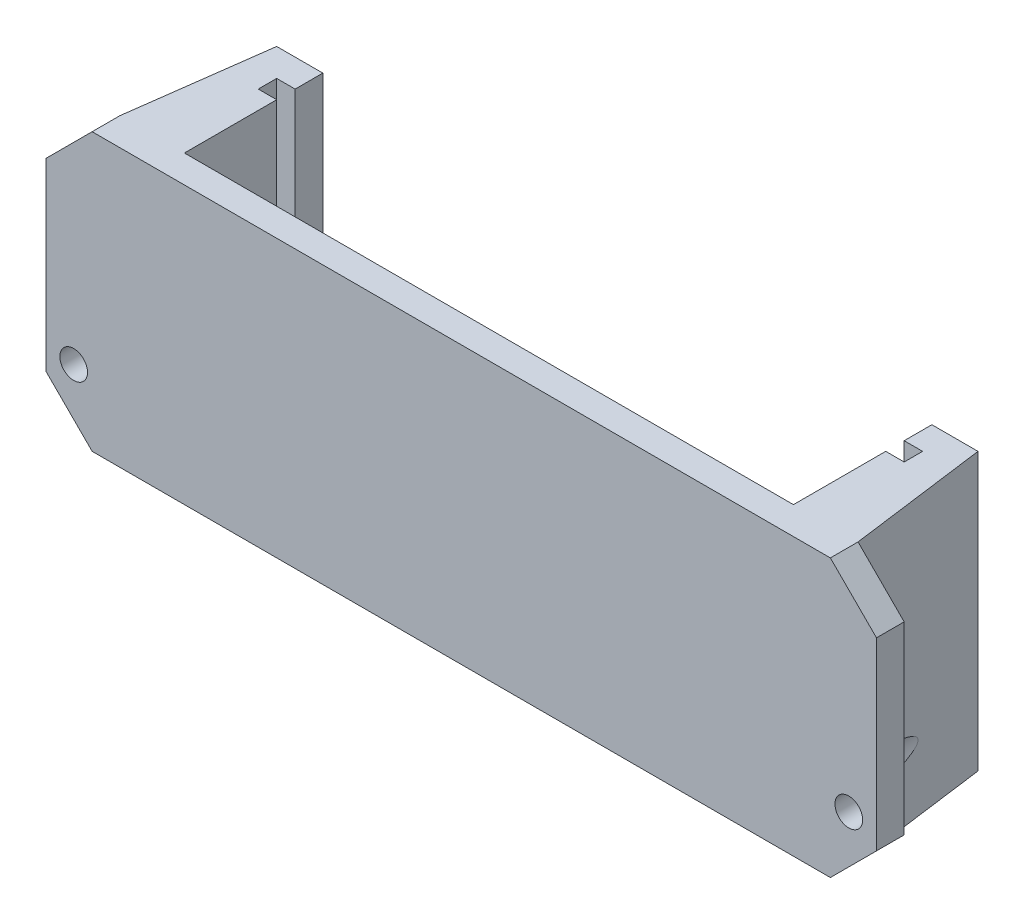
ISO-10303-21;
HEADER;
FILE_DESCRIPTION(('STEP AP214'),'2;1');
FILE_NAME('part.step','',(''),(''),'','','');
FILE_SCHEMA(('AUTOMOTIVE_DESIGN { 1 0 10303 214 1 1 1 1 }'));
ENDSEC;
DATA;
#1=APPLICATION_CONTEXT('core data for automotive mechanical design processes');
#2=APPLICATION_PROTOCOL_DEFINITION('international standard','automotive_design',2000,#1);
#3=PRODUCT_CONTEXT('',#1,'mechanical');
#4=PRODUCT('Part','Part','',(#3));
#5=PRODUCT_RELATED_PRODUCT_CATEGORY('part','',(#4));
#6=PRODUCT_DEFINITION_FORMATION('','',#4);
#7=PRODUCT_DEFINITION_CONTEXT('part definition',#1,'design');
#8=PRODUCT_DEFINITION('design','',#6,#7);
#9=PRODUCT_DEFINITION_SHAPE('','',#8);
#10=(LENGTH_UNIT() NAMED_UNIT(*) SI_UNIT(.MILLI.,.METRE.));
#11=(NAMED_UNIT(*) PLANE_ANGLE_UNIT() SI_UNIT($,.RADIAN.));
#12=(NAMED_UNIT(*) SI_UNIT($,.STERADIAN.) SOLID_ANGLE_UNIT());
#13=UNCERTAINTY_MEASURE_WITH_UNIT(LENGTH_MEASURE(1.E-05),#10,'distance_accuracy_value','');
#14=(GEOMETRIC_REPRESENTATION_CONTEXT(3) GLOBAL_UNCERTAINTY_ASSIGNED_CONTEXT((#13)) GLOBAL_UNIT_ASSIGNED_CONTEXT((#10,
#11,#12)) REPRESENTATION_CONTEXT('',''));
#15=CARTESIAN_POINT('',(0.,0.,0.));
#16=DIRECTION('',(0.,0.,1.));
#17=DIRECTION('',(1.,0.,0.));
#18=AXIS2_PLACEMENT_3D('',#15,#16,#17);
#19=CARTESIAN_POINT('',(80.,30.,0.));
#20=DIRECTION('',(1.,0.,0.));
#21=DIRECTION('',(0.,0.,-1.));
#22=AXIS2_PLACEMENT_3D('',#19,#20,#21);
#23=PLANE('',#22);
#24=DIRECTION('',(0.,-1.,0.));
#25=VECTOR('',#24,1.);
#26=CARTESIAN_POINT('',(80.,30.,6.10718144632312));
#27=LINE('',#26,#25);
#28=CARTESIAN_POINT('',(80.,25.,6.10718144632312));
#29=VERTEX_POINT('',#28);
#30=CARTESIAN_POINT('',(80.,5.,6.10718144632312));
#31=VERTEX_POINT('',#30);
#32=EDGE_CURVE('E324',#29,#31,#27,.T.);
#33=ORIENTED_EDGE('',*,*,#32,.T.);
#34=DIRECTION('',(0.,0.,-1.));
#35=VECTOR('',#34,1.);
#36=CARTESIAN_POINT('',(80.,5.,3.10718144632312));
#37=LINE('',#36,#35);
#38=CARTESIAN_POINT('',(80.,5.,3.10718144632312));
#39=VERTEX_POINT('',#38);
#40=EDGE_CURVE('E289',#31,#39,#37,.T.);
#41=ORIENTED_EDGE('',*,*,#40,.T.);
#42=DIRECTION('',(0.,-1.,0.));
#43=VECTOR('',#42,1.);
#44=CARTESIAN_POINT('',(80.,30.,3.10718144632312));
#45=LINE('',#44,#43);
#46=CARTESIAN_POINT('',(80.,25.,3.10718144632312));
#47=VERTEX_POINT('',#46);
#48=EDGE_CURVE('E258',#47,#39,#45,.T.);
#49=ORIENTED_EDGE('',*,*,#48,.F.);
#50=DIRECTION('',(0.,0.,1.));
#51=VECTOR('',#50,1.);
#52=CARTESIAN_POINT('',(80.,25.,0.));
#53=LINE('',#52,#51);
#54=EDGE_CURVE('E286',#47,#29,#53,.T.);
#55=ORIENTED_EDGE('',*,*,#54,.T.);
#56=EDGE_LOOP('',(#33,#41,#49,#55));
#57=FACE_BOUND('',#56,.T.);
#58=ADVANCED_FACE('F35',(#57),#23,.T.);
#59=CARTESIAN_POINT('',(0.,30.,3.10718144632312));
#60=DIRECTION('',(0.,0.,-1.));
#61=DIRECTION('',(-1.,0.,0.));
#62=AXIS2_PLACEMENT_3D('',#59,#60,#61);
#63=PLANE('',#62);
#64=ORIENTED_EDGE('',*,*,#48,.T.);
#65=DIRECTION('',(-0.707106781186547,-0.707106781186549,0.));
#66=VECTOR('',#65,1.);
#67=CARTESIAN_POINT('',(52.5000000000001,-22.5,3.10718144632312));
#68=LINE('',#67,#66);
#69=CARTESIAN_POINT('',(74.9999999999999,0.,3.10718144632312));
#70=VERTEX_POINT('',#69);
#71=EDGE_CURVE('E293',#39,#70,#68,.T.);
#72=ORIENTED_EDGE('',*,*,#71,.T.);
#73=DIRECTION('',(0.,-1.,0.));
#74=VECTOR('',#73,1.);
#75=CARTESIAN_POINT('',(74.9999999999999,30.,3.10718144632312));
#76=LINE('',#75,#74);
#77=CARTESIAN_POINT('',(74.9999999999999,4.91863630930502,3.10718144632312));
#78=VERTEX_POINT('',#77);
#79=EDGE_CURVE('E254',#78,#70,#76,.T.);
#80=ORIENTED_EDGE('',*,*,#79,.F.);
#81=CARTESIAN_POINT('',(77.,7.15470428680476,3.10718144632312));
#82=DIRECTION('',(0.,0.,-1.));
#83=DIRECTION('',(-1.,0.,0.));
#84=AXIS2_PLACEMENT_3D('',#81,#82,#83);
#85=CIRCLE('',#84,3.00000000000001);
#86=CARTESIAN_POINT('',(74.9999999999999,9.39077226430449,3.10718144632312));
#87=VERTEX_POINT('',#86);
#88=EDGE_CURVE('E203',#78,#87,#85,.T.);
#89=ORIENTED_EDGE('',*,*,#88,.T.);
#90=CARTESIAN_POINT('',(74.9999999999999,30.,3.10718144632312));
#91=VERTEX_POINT('',#90);
#92=EDGE_CURVE('E255',#91,#87,#76,.T.);
#93=ORIENTED_EDGE('',*,*,#92,.F.);
#94=DIRECTION('',(-0.707106781186549,0.707106781186547,0.));
#95=VECTOR('',#94,1.);
#96=CARTESIAN_POINT('',(37.4999999999999,67.5,3.10718144632312));
#97=LINE('',#96,#95);
#98=EDGE_CURVE('E291',#91,#47,#97,.F.);
#99=ORIENTED_EDGE('',*,*,#98,.T.);
#100=EDGE_LOOP('',(#64,#72,#80,#89,#93,#99));
#101=FACE_BOUND('',#100,.T.);
#102=CARTESIAN_POINT('',(77.,7.15470428680476,3.10718144632312));
#103=DIRECTION('',(0.,0.,-1.));
#104=DIRECTION('',(-1.,0.,0.));
#105=AXIS2_PLACEMENT_3D('',#102,#103,#104);
#106=CIRCLE('',#105,1.5);
#107=CARTESIAN_POINT('',(75.5,7.15470428680476,3.10718144632312));
#108=VERTEX_POINT('',#107);
#109=EDGE_CURVE('E270',#108,#108,#106,.T.);
#110=ORIENTED_EDGE('',*,*,#109,.F.);
#111=EDGE_LOOP('',(#110));
#112=FACE_BOUND('',#111,.T.);
#113=ADVANCED_FACE('F410',(#101,#112),#63,.T.);
#114=CARTESIAN_POINT('',(73.2829019939315,30.,-9.77105359919046));
#115=DIRECTION('',(0.991227900682635,0.,-0.132163720091013));
#116=DIRECTION('',(-0.132163720091013,0.,-0.991227900682636));
#117=AXIS2_PLACEMENT_3D('',#114,#115,#116);
#118=PLANE('',#117);
#119=ORIENTED_EDGE('',*,*,#92,.T.);
#120=CARTESIAN_POINT('',(77.,7.15470428680476,18.1071814463243));
#121=DIRECTION('',(0.991227900682635,0.,-0.132163720091013));
#122=DIRECTION('',(0.132163720091013,0.,0.991227900682635));
#123=AXIS2_PLACEMENT_3D('',#120,#121,#122);
#124=ELLIPSE('',#123,22.6991189256333,3.00000000000001);
#125=EDGE_CURVE('E261',#87,#78,#124,.F.);
#126=ORIENTED_EDGE('',*,*,#125,.T.);
#127=ORIENTED_EDGE('',*,*,#79,.T.);
#128=DIRECTION('',(0.132163720091013,0.,0.991227900682636));
#129=VECTOR('',#128,1.);
#130=CARTESIAN_POINT('',(73.2829019939315,0.,-9.77105359919046));
#131=LINE('',#130,#129);
#132=CARTESIAN_POINT('',(73.,0.,-11.8928185536769));
#133=VERTEX_POINT('',#132);
#134=EDGE_CURVE('E265',#133,#70,#131,.T.);
#135=ORIENTED_EDGE('',*,*,#134,.F.);
#136=DIRECTION('',(0.,-1.,0.));
#137=VECTOR('',#136,1.);
#138=CARTESIAN_POINT('',(73.,30.,-11.8928185536769));
#139=LINE('',#138,#137);
#140=CARTESIAN_POINT('',(73.,30.,-11.8928185536769));
#141=VERTEX_POINT('',#140);
#142=EDGE_CURVE('E252',#141,#133,#139,.T.);
#143=ORIENTED_EDGE('',*,*,#142,.F.);
#144=DIRECTION('',(0.132163720091013,0.,0.991227900682636));
#145=VECTOR('',#144,1.);
#146=CARTESIAN_POINT('',(73.2829019939315,30.,-9.77105359919046));
#147=LINE('',#146,#145);
#148=EDGE_CURVE('E330',#141,#91,#147,.T.);
#149=ORIENTED_EDGE('',*,*,#148,.T.);
#150=EDGE_LOOP('',(#119,#126,#127,#135,#143,#149));
#151=FACE_BOUND('',#150,.T.);
#152=ADVANCED_FACE('F415',(#151),#118,.T.);
#153=CARTESIAN_POINT('',(0.,30.,-11.8928185536769));
#154=DIRECTION('',(0.,0.,-1.));
#155=DIRECTION('',(-1.,0.,0.));
#156=AXIS2_PLACEMENT_3D('',#153,#154,#155);
#157=PLANE('',#156);
#158=DIRECTION('',(1.,0.,0.));
#159=VECTOR('',#158,1.);
#160=CARTESIAN_POINT('',(0.,0.,-11.8928185536769));
#161=LINE('',#160,#159);
#162=CARTESIAN_POINT('',(68.,0.,-11.8928185536769));
#163=VERTEX_POINT('',#162);
#164=EDGE_CURVE('E360',#163,#133,#161,.T.);
#165=ORIENTED_EDGE('',*,*,#164,.F.);
#166=DIRECTION('',(0.,-1.,0.));
#167=VECTOR('',#166,1.);
#168=CARTESIAN_POINT('',(68.,30.,-11.8928185536769));
#169=LINE('',#168,#167);
#170=CARTESIAN_POINT('',(68.,30.,-11.8928185536769));
#171=VERTEX_POINT('',#170);
#172=EDGE_CURVE('E250',#171,#163,#169,.T.);
#173=ORIENTED_EDGE('',*,*,#172,.F.);
#174=DIRECTION('',(1.,0.,0.));
#175=VECTOR('',#174,1.);
#176=CARTESIAN_POINT('',(0.,30.,-11.8928185536769));
#177=LINE('',#176,#175);
#178=EDGE_CURVE('E395',#171,#141,#177,.T.);
#179=ORIENTED_EDGE('',*,*,#178,.T.);
#180=ORIENTED_EDGE('',*,*,#142,.T.);
#181=EDGE_LOOP('',(#165,#173,#179,#180));
#182=FACE_BOUND('',#181,.T.);
#183=ADVANCED_FACE('F438',(#182),#157,.T.);
#184=CARTESIAN_POINT('',(68.,30.,0.));
#185=DIRECTION('',(-1.,0.,0.));
#186=DIRECTION('',(0.,0.,1.));
#187=AXIS2_PLACEMENT_3D('',#184,#185,#186);
#188=PLANE('',#187);
#189=DIRECTION('',(0.,0.,-1.));
#190=VECTOR('',#189,1.);
#191=CARTESIAN_POINT('',(68.,0.,0.));
#192=LINE('',#191,#190);
#193=CARTESIAN_POINT('',(68.,0.,-8.89281855367688));
#194=VERTEX_POINT('',#193);
#195=EDGE_CURVE('E357',#194,#163,#192,.T.);
#196=ORIENTED_EDGE('',*,*,#195,.F.);
#197=DIRECTION('',(0.,-1.,0.));
#198=VECTOR('',#197,1.);
#199=CARTESIAN_POINT('',(68.,30.,-8.89281855367688));
#200=LINE('',#199,#198);
#201=CARTESIAN_POINT('',(68.,30.,-8.89281855367688));
#202=VERTEX_POINT('',#201);
#203=EDGE_CURVE('E248',#202,#194,#200,.T.);
#204=ORIENTED_EDGE('',*,*,#203,.F.);
#205=DIRECTION('',(0.,0.,-1.));
#206=VECTOR('',#205,1.);
#207=CARTESIAN_POINT('',(68.,30.,0.));
#208=LINE('',#207,#206);
#209=EDGE_CURVE('E392',#202,#171,#208,.T.);
#210=ORIENTED_EDGE('',*,*,#209,.T.);
#211=ORIENTED_EDGE('',*,*,#172,.T.);
#212=EDGE_LOOP('',(#196,#204,#210,#211));
#213=FACE_BOUND('',#212,.T.);
#214=ADVANCED_FACE('F442',(#213),#188,.T.);
#215=CARTESIAN_POINT('',(0.,30.,-8.89281855367682));
#216=DIRECTION('',(0.,0.,1.));
#217=DIRECTION('',(1.,0.,0.));
#218=AXIS2_PLACEMENT_3D('',#215,#216,#217);
#219=PLANE('',#218);
#220=DIRECTION('',(-1.,0.,0.));
#221=VECTOR('',#220,1.);
#222=CARTESIAN_POINT('',(0.,0.,-8.89281855367682));
#223=LINE('',#222,#221);
#224=CARTESIAN_POINT('',(70.,0.,-8.89281855367688));
#225=VERTEX_POINT('',#224);
#226=EDGE_CURVE('E354',#225,#194,#223,.T.);
#227=ORIENTED_EDGE('',*,*,#226,.F.);
#228=DIRECTION('',(0.,-1.,0.));
#229=VECTOR('',#228,1.);
#230=CARTESIAN_POINT('',(70.,30.,-8.89281855367688));
#231=LINE('',#230,#229);
#232=CARTESIAN_POINT('',(70.,30.,-8.89281855367688));
#233=VERTEX_POINT('',#232);
#234=EDGE_CURVE('E246',#233,#225,#231,.T.);
#235=ORIENTED_EDGE('',*,*,#234,.F.);
#236=DIRECTION('',(-1.,0.,0.));
#237=VECTOR('',#236,1.);
#238=CARTESIAN_POINT('',(0.,30.,-8.89281855367682));
#239=LINE('',#238,#237);
#240=EDGE_CURVE('E389',#233,#202,#239,.T.);
#241=ORIENTED_EDGE('',*,*,#240,.T.);
#242=ORIENTED_EDGE('',*,*,#203,.T.);
#243=EDGE_LOOP('',(#227,#235,#241,#242));
#244=FACE_BOUND('',#243,.T.);
#245=ADVANCED_FACE('F445',(#244),#219,.T.);
#246=CARTESIAN_POINT('',(70.,30.,0.));
#247=DIRECTION('',(-1.,0.,0.));
#248=DIRECTION('',(0.,0.,1.));
#249=AXIS2_PLACEMENT_3D('',#246,#247,#248);
#250=PLANE('',#249);
#251=DIRECTION('',(0.,0.,-1.));
#252=VECTOR('',#251,1.);
#253=CARTESIAN_POINT('',(70.,0.,0.));
#254=LINE('',#253,#252);
#255=CARTESIAN_POINT('',(70.,0.,-6.89281855367689));
#256=VERTEX_POINT('',#255);
#257=EDGE_CURVE('E351',#256,#225,#254,.T.);
#258=ORIENTED_EDGE('',*,*,#257,.F.);
#259=DIRECTION('',(0.,-1.,0.));
#260=VECTOR('',#259,1.);
#261=CARTESIAN_POINT('',(70.,30.,-6.89281855367689));
#262=LINE('',#261,#260);
#263=CARTESIAN_POINT('',(70.,30.,-6.89281855367689));
#264=VERTEX_POINT('',#263);
#265=EDGE_CURVE('E244',#264,#256,#262,.T.);
#266=ORIENTED_EDGE('',*,*,#265,.F.);
#267=DIRECTION('',(0.,0.,-1.));
#268=VECTOR('',#267,1.);
#269=CARTESIAN_POINT('',(70.,30.,0.));
#270=LINE('',#269,#268);
#271=EDGE_CURVE('E386',#264,#233,#270,.T.);
#272=ORIENTED_EDGE('',*,*,#271,.T.);
#273=ORIENTED_EDGE('',*,*,#234,.T.);
#274=EDGE_LOOP('',(#258,#266,#272,#273));
#275=FACE_BOUND('',#274,.T.);
#276=ADVANCED_FACE('F450',(#275),#250,.T.);
#277=CARTESIAN_POINT('',(0.,30.,-6.89281855367689));
#278=DIRECTION('',(0.,0.,-1.));
#279=DIRECTION('',(-1.,0.,0.));
#280=AXIS2_PLACEMENT_3D('',#277,#278,#279);
#281=PLANE('',#280);
#282=DIRECTION('',(1.,0.,0.));
#283=VECTOR('',#282,1.);
#284=CARTESIAN_POINT('',(0.,0.,-6.89281855367689));
#285=LINE('',#284,#283);
#286=CARTESIAN_POINT('',(68.,0.,-6.89281855367689));
#287=VERTEX_POINT('',#286);
#288=EDGE_CURVE('E348',#287,#256,#285,.T.);
#289=ORIENTED_EDGE('',*,*,#288,.F.);
#290=DIRECTION('',(0.,-1.,0.));
#291=VECTOR('',#290,1.);
#292=CARTESIAN_POINT('',(68.,30.,-6.89281855367689));
#293=LINE('',#292,#291);
#294=CARTESIAN_POINT('',(68.,30.,-6.89281855367689));
#295=VERTEX_POINT('',#294);
#296=EDGE_CURVE('E242',#295,#287,#293,.T.);
#297=ORIENTED_EDGE('',*,*,#296,.F.);
#298=DIRECTION('',(1.,0.,0.));
#299=VECTOR('',#298,1.);
#300=CARTESIAN_POINT('',(0.,30.,-6.89281855367689));
#301=LINE('',#300,#299);
#302=EDGE_CURVE('E383',#295,#264,#301,.T.);
#303=ORIENTED_EDGE('',*,*,#302,.T.);
#304=ORIENTED_EDGE('',*,*,#265,.T.);
#305=EDGE_LOOP('',(#289,#297,#303,#304));
#306=FACE_BOUND('',#305,.T.);
#307=ADVANCED_FACE('F453',(#306),#281,.T.);
#308=CARTESIAN_POINT('',(68.,30.,0.));
#309=DIRECTION('',(-1.,0.,0.));
#310=DIRECTION('',(0.,0.,1.));
#311=AXIS2_PLACEMENT_3D('',#308,#309,#310);
#312=PLANE('',#311);
#313=DIRECTION('',(0.,0.,-1.));
#314=VECTOR('',#313,1.);
#315=CARTESIAN_POINT('',(68.,0.,0.));
#316=LINE('',#315,#314);
#317=CARTESIAN_POINT('',(68.,0.,3.10718144632312));
#318=VERTEX_POINT('',#317);
#319=EDGE_CURVE('E345',#318,#287,#316,.T.);
#320=ORIENTED_EDGE('',*,*,#319,.F.);
#321=DIRECTION('',(0.,-1.,0.));
#322=VECTOR('',#321,1.);
#323=CARTESIAN_POINT('',(68.,30.,3.10718144632312));
#324=LINE('',#323,#322);
#325=CARTESIAN_POINT('',(68.,30.,3.10718144632312));
#326=VERTEX_POINT('',#325);
#327=EDGE_CURVE('E240',#326,#318,#324,.T.);
#328=ORIENTED_EDGE('',*,*,#327,.F.);
#329=DIRECTION('',(0.,0.,-1.));
#330=VECTOR('',#329,1.);
#331=CARTESIAN_POINT('',(68.,30.,0.));
#332=LINE('',#331,#330);
#333=EDGE_CURVE('E380',#326,#295,#332,.T.);
#334=ORIENTED_EDGE('',*,*,#333,.T.);
#335=ORIENTED_EDGE('',*,*,#296,.T.);
#336=EDGE_LOOP('',(#320,#328,#334,#335));
#337=FACE_BOUND('',#336,.T.);
#338=ADVANCED_FACE('F458',(#337),#312,.T.);
#339=DIRECTION('',(1.,0.,0.));
#340=VECTOR('',#339,1.);
#341=CARTESIAN_POINT('',(0.,0.,3.10718144632312));
#342=LINE('',#341,#340);
#343=CARTESIAN_POINT('',(2.,0.,3.10718144632312));
#344=VERTEX_POINT('',#343);
#345=EDGE_CURVE('E344',#344,#318,#342,.T.);
#346=ORIENTED_EDGE('',*,*,#345,.F.);
#347=DIRECTION('',(0.,-1.,0.));
#348=VECTOR('',#347,1.);
#349=CARTESIAN_POINT('',(2.,30.,3.10718144632312));
#350=LINE('',#349,#348);
#351=CARTESIAN_POINT('',(2.,30.,3.10718144632312));
#352=VERTEX_POINT('',#351);
#353=EDGE_CURVE('E238',#352,#344,#350,.T.);
#354=ORIENTED_EDGE('',*,*,#353,.F.);
#355=DIRECTION('',(1.,0.,0.));
#356=VECTOR('',#355,1.);
#357=CARTESIAN_POINT('',(0.,30.,3.10718144632312));
#358=LINE('',#357,#356);
#359=EDGE_CURVE('E379',#352,#326,#358,.T.);
#360=ORIENTED_EDGE('',*,*,#359,.T.);
#361=ORIENTED_EDGE('',*,*,#327,.T.);
#362=EDGE_LOOP('',(#346,#354,#360,#361));
#363=FACE_BOUND('',#362,.T.);
#364=ADVANCED_FACE('F461',(#363),#63,.T.);
#365=CARTESIAN_POINT('',(2.,30.,0.));
#366=DIRECTION('',(-1.,0.,0.));
#367=DIRECTION('',(0.,0.,1.));
#368=AXIS2_PLACEMENT_3D('',#365,#366,#367);
#369=PLANE('',#368);
#370=DIRECTION('',(0.,0.,-1.));
#371=VECTOR('',#370,1.);
#372=CARTESIAN_POINT('',(2.,0.,0.));
#373=LINE('',#372,#371);
#374=CARTESIAN_POINT('',(2.,0.,-6.89281855367688));
#375=VERTEX_POINT('',#374);
#376=EDGE_CURVE('E342',#344,#375,#373,.T.);
#377=ORIENTED_EDGE('',*,*,#376,.T.);
#378=DIRECTION('',(0.,-1.,0.));
#379=VECTOR('',#378,1.);
#380=CARTESIAN_POINT('',(2.,30.,-6.89281855367688));
#381=LINE('',#380,#379);
#382=CARTESIAN_POINT('',(2.,30.,-6.89281855367688));
#383=VERTEX_POINT('',#382);
#384=EDGE_CURVE('E235',#383,#375,#381,.T.);
#385=ORIENTED_EDGE('',*,*,#384,.F.);
#386=DIRECTION('',(0.,0.,-1.));
#387=VECTOR('',#386,1.);
#388=CARTESIAN_POINT('',(2.,30.,0.));
#389=LINE('',#388,#387);
#390=EDGE_CURVE('E377',#352,#383,#389,.T.);
#391=ORIENTED_EDGE('',*,*,#390,.F.);
#392=ORIENTED_EDGE('',*,*,#353,.T.);
#393=EDGE_LOOP('',(#377,#385,#391,#392));
#394=FACE_BOUND('',#393,.T.);
#395=ADVANCED_FACE('F467',(#394),#369,.F.);
#396=CARTESIAN_POINT('',(0.,30.,-6.89281855367688));
#397=DIRECTION('',(0.,0.,1.));
#398=DIRECTION('',(1.,0.,0.));
#399=AXIS2_PLACEMENT_3D('',#396,#397,#398);
#400=PLANE('',#399);
#401=DIRECTION('',(-1.,0.,0.));
#402=VECTOR('',#401,1.);
#403=CARTESIAN_POINT('',(0.,0.,-6.89281855367688));
#404=LINE('',#403,#402);
#405=CARTESIAN_POINT('',(0.,0.,-6.89281855367688));
#406=VERTEX_POINT('',#405);
#407=EDGE_CURVE('E340',#375,#406,#404,.T.);
#408=ORIENTED_EDGE('',*,*,#407,.T.);
#409=DIRECTION('',(0.,-1.,0.));
#410=VECTOR('',#409,1.);
#411=CARTESIAN_POINT('',(0.,30.,-6.89281855367688));
#412=LINE('',#411,#410);
#413=CARTESIAN_POINT('',(0.,30.,-6.89281855367688));
#414=VERTEX_POINT('',#413);
#415=EDGE_CURVE('E232',#414,#406,#412,.T.);
#416=ORIENTED_EDGE('',*,*,#415,.F.);
#417=DIRECTION('',(-1.,0.,0.));
#418=VECTOR('',#417,1.);
#419=CARTESIAN_POINT('',(0.,30.,-6.89281855367688));
#420=LINE('',#419,#418);
#421=EDGE_CURVE('E375',#383,#414,#420,.T.);
#422=ORIENTED_EDGE('',*,*,#421,.F.);
#423=ORIENTED_EDGE('',*,*,#384,.T.);
#424=EDGE_LOOP('',(#408,#416,#422,#423));
#425=FACE_BOUND('',#424,.T.);
#426=ADVANCED_FACE('F471',(#425),#400,.F.);
#427=CARTESIAN_POINT('',(0.,30.,0.));
#428=DIRECTION('',(-1.,0.,0.));
#429=DIRECTION('',(0.,0.,1.));
#430=AXIS2_PLACEMENT_3D('',#427,#428,#429);
#431=PLANE('',#430);
#432=DIRECTION('',(0.,0.,-1.));
#433=VECTOR('',#432,1.);
#434=CARTESIAN_POINT('',(0.,0.,0.));
#435=LINE('',#434,#433);
#436=CARTESIAN_POINT('',(0.,0.,-8.89281855367688));
#437=VERTEX_POINT('',#436);
#438=EDGE_CURVE('E338',#406,#437,#435,.T.);
#439=ORIENTED_EDGE('',*,*,#438,.T.);
#440=DIRECTION('',(0.,-1.,0.));
#441=VECTOR('',#440,1.);
#442=CARTESIAN_POINT('',(0.,30.,-8.89281855367688));
#443=LINE('',#442,#441);
#444=CARTESIAN_POINT('',(0.,30.,-8.89281855367688));
#445=VERTEX_POINT('',#444);
#446=EDGE_CURVE('E229',#445,#437,#443,.T.);
#447=ORIENTED_EDGE('',*,*,#446,.F.);
#448=DIRECTION('',(0.,0.,-1.));
#449=VECTOR('',#448,1.);
#450=CARTESIAN_POINT('',(0.,30.,0.));
#451=LINE('',#450,#449);
#452=EDGE_CURVE('E373',#414,#445,#451,.T.);
#453=ORIENTED_EDGE('',*,*,#452,.F.);
#454=ORIENTED_EDGE('',*,*,#415,.T.);
#455=EDGE_LOOP('',(#439,#447,#453,#454));
#456=FACE_BOUND('',#455,.T.);
#457=ADVANCED_FACE('F476',(#456),#431,.F.);
#458=CARTESIAN_POINT('',(0.,30.,-8.89281855367688));
#459=DIRECTION('',(0.,0.,-1.));
#460=DIRECTION('',(-1.,0.,0.));
#461=AXIS2_PLACEMENT_3D('',#458,#459,#460);
#462=PLANE('',#461);
#463=DIRECTION('',(1.,0.,0.));
#464=VECTOR('',#463,1.);
#465=CARTESIAN_POINT('',(0.,0.,-8.89281855367688));
#466=LINE('',#465,#464);
#467=CARTESIAN_POINT('',(2.,0.,-8.89281855367688));
#468=VERTEX_POINT('',#467);
#469=EDGE_CURVE('E336',#437,#468,#466,.T.);
#470=ORIENTED_EDGE('',*,*,#469,.T.);
#471=DIRECTION('',(0.,-1.,0.));
#472=VECTOR('',#471,1.);
#473=CARTESIAN_POINT('',(2.,30.,-8.89281855367688));
#474=LINE('',#473,#472);
#475=CARTESIAN_POINT('',(2.,30.,-8.89281855367688));
#476=VERTEX_POINT('',#475);
#477=EDGE_CURVE('E226',#476,#468,#474,.T.);
#478=ORIENTED_EDGE('',*,*,#477,.F.);
#479=DIRECTION('',(1.,0.,0.));
#480=VECTOR('',#479,1.);
#481=CARTESIAN_POINT('',(0.,30.,-8.89281855367688));
#482=LINE('',#481,#480);
#483=EDGE_CURVE('E371',#445,#476,#482,.T.);
#484=ORIENTED_EDGE('',*,*,#483,.F.);
#485=ORIENTED_EDGE('',*,*,#446,.T.);
#486=EDGE_LOOP('',(#470,#478,#484,#485));
#487=FACE_BOUND('',#486,.T.);
#488=ADVANCED_FACE('F482',(#487),#462,.F.);
#489=CARTESIAN_POINT('',(2.,30.,0.));
#490=DIRECTION('',(-1.,0.,0.));
#491=DIRECTION('',(0.,0.,1.));
#492=AXIS2_PLACEMENT_3D('',#489,#490,#491);
#493=PLANE('',#492);
#494=DIRECTION('',(0.,0.,-1.));
#495=VECTOR('',#494,1.);
#496=CARTESIAN_POINT('',(2.,0.,0.));
#497=LINE('',#496,#495);
#498=CARTESIAN_POINT('',(2.,0.,-11.8928185536769));
#499=VERTEX_POINT('',#498);
#500=EDGE_CURVE('E334',#468,#499,#497,.T.);
#501=ORIENTED_EDGE('',*,*,#500,.T.);
#502=DIRECTION('',(0.,-1.,0.));
#503=VECTOR('',#502,1.);
#504=CARTESIAN_POINT('',(2.,30.,-11.8928185536769));
#505=LINE('',#504,#503);
#506=CARTESIAN_POINT('',(2.,30.,-11.8928185536769));
#507=VERTEX_POINT('',#506);
#508=EDGE_CURVE('E223',#507,#499,#505,.T.);
#509=ORIENTED_EDGE('',*,*,#508,.F.);
#510=DIRECTION('',(0.,0.,-1.));
#511=VECTOR('',#510,1.);
#512=CARTESIAN_POINT('',(2.,30.,0.));
#513=LINE('',#512,#511);
#514=EDGE_CURVE('E369',#476,#507,#513,.T.);
#515=ORIENTED_EDGE('',*,*,#514,.F.);
#516=ORIENTED_EDGE('',*,*,#477,.T.);
#517=EDGE_LOOP('',(#501,#509,#515,#516));
#518=FACE_BOUND('',#517,.T.);
#519=ADVANCED_FACE('F486',(#518),#493,.F.);
#520=CARTESIAN_POINT('',(0.,30.,-11.8928185536769));
#521=DIRECTION('',(0.,0.,1.));
#522=DIRECTION('',(1.,0.,0.));
#523=AXIS2_PLACEMENT_3D('',#520,#521,#522);
#524=PLANE('',#523);
#525=DIRECTION('',(-1.,0.,0.));
#526=VECTOR('',#525,1.);
#527=CARTESIAN_POINT('',(0.,0.,-11.8928185536769));
#528=LINE('',#527,#526);
#529=CARTESIAN_POINT('',(-3.,0.,-11.8928185536769));
#530=VERTEX_POINT('',#529);
#531=EDGE_CURVE('E332',#499,#530,#528,.T.);
#532=ORIENTED_EDGE('',*,*,#531,.T.);
#533=DIRECTION('',(0.,-1.,0.));
#534=VECTOR('',#533,1.);
#535=CARTESIAN_POINT('',(-3.,30.,-11.8928185536769));
#536=LINE('',#535,#534);
#537=CARTESIAN_POINT('',(-3.,30.,-11.8928185536769));
#538=VERTEX_POINT('',#537);
#539=EDGE_CURVE('E217',#538,#530,#536,.T.);
#540=ORIENTED_EDGE('',*,*,#539,.F.);
#541=DIRECTION('',(-1.,0.,0.));
#542=VECTOR('',#541,1.);
#543=CARTESIAN_POINT('',(0.,30.,-11.8928185536769));
#544=LINE('',#543,#542);
#545=EDGE_CURVE('E314',#507,#538,#544,.T.);
#546=ORIENTED_EDGE('',*,*,#545,.F.);
#547=ORIENTED_EDGE('',*,*,#508,.T.);
#548=EDGE_LOOP('',(#532,#540,#546,#547));
#549=FACE_BOUND('',#548,.T.);
#550=ADVANCED_FACE('F489',(#549),#524,.F.);
#551=CARTESIAN_POINT('',(-4.50560941751226,30.,-0.600747922334966));
#552=DIRECTION('',(0.991227900682635,0.,0.132163720091018));
#553=DIRECTION('',(0.132163720091018,0.,-0.991227900682635));
#554=AXIS2_PLACEMENT_3D('',#551,#552,#553);
#555=PLANE('',#554);
#556=CARTESIAN_POINT('',(-7.,7.15470428680476,18.1071814463232));
#557=DIRECTION('',(0.991227900682635,0.,0.132163720091018));
#558=DIRECTION('',(-0.132163720091018,0.,0.991227900682635));
#559=AXIS2_PLACEMENT_3D('',#556,#557,#558);
#560=ELLIPSE('',#559,22.6991189256324,3.);
#561=CARTESIAN_POINT('',(-5.,9.39077226430455,3.10718144632312));
#562=VERTEX_POINT('',#561);
#563=CARTESIAN_POINT('',(-5.,4.91863630930497,3.10718144632312));
#564=VERTEX_POINT('',#563);
#565=EDGE_CURVE('E195',#562,#564,#560,.F.);
#566=ORIENTED_EDGE('',*,*,#565,.F.);
#567=DIRECTION('',(0.,-1.,0.));
#568=VECTOR('',#567,1.);
#569=CARTESIAN_POINT('',(-5.,30.,3.10718144632312));
#570=LINE('',#569,#568);
#571=CARTESIAN_POINT('',(-5.,30.,3.10718144632312));
#572=VERTEX_POINT('',#571);
#573=EDGE_CURVE('E209',#572,#562,#570,.T.);
#574=ORIENTED_EDGE('',*,*,#573,.F.);
#575=DIRECTION('',(-0.132163720091018,0.,0.991227900682635));
#576=VECTOR('',#575,1.);
#577=CARTESIAN_POINT('',(-4.50560941751226,30.,-0.600747922334966));
#578=LINE('',#577,#576);
#579=EDGE_CURVE('E309',#538,#572,#578,.T.);
#580=ORIENTED_EDGE('',*,*,#579,.F.);
#581=ORIENTED_EDGE('',*,*,#539,.T.);
#582=DIRECTION('',(-0.132163720091018,0.,0.991227900682635));
#583=VECTOR('',#582,1.);
#584=CARTESIAN_POINT('',(-4.50560941751226,0.,-0.600747922334966));
#585=LINE('',#584,#583);
#586=CARTESIAN_POINT('',(-5.,0.,3.10718144632312));
#587=VERTEX_POINT('',#586);
#588=EDGE_CURVE('E214',#530,#587,#585,.T.);
#589=ORIENTED_EDGE('',*,*,#588,.T.);
#590=EDGE_CURVE('E207',#564,#587,#570,.T.);
#591=ORIENTED_EDGE('',*,*,#590,.F.);
#592=EDGE_LOOP('',(#566,#574,#580,#581,#589,#591));
#593=FACE_BOUND('',#592,.T.);
#594=ADVANCED_FACE('F211',(#593),#555,.F.);
#595=ORIENTED_EDGE('',*,*,#590,.T.);
#596=DIRECTION('',(0.707106781186549,-0.707106781186547,0.));
#597=VECTOR('',#596,1.);
#598=CARTESIAN_POINT('',(-17.5,12.5,3.10718144632312));
#599=LINE('',#598,#597);
#600=CARTESIAN_POINT('',(-10.,4.99999999999999,3.10718144632312));
#601=VERTEX_POINT('',#600);
#602=EDGE_CURVE('E11',#587,#601,#599,.F.);
#603=ORIENTED_EDGE('',*,*,#602,.T.);
#604=DIRECTION('',(0.,-1.,0.));
#605=VECTOR('',#604,1.);
#606=CARTESIAN_POINT('',(-10.,30.,3.10718144632312));
#607=LINE('',#606,#605);
#608=CARTESIAN_POINT('',(-10.,25.,3.10718144632312));
#609=VERTEX_POINT('',#608);
#610=EDGE_CURVE('E215',#609,#601,#607,.T.);
#611=ORIENTED_EDGE('',*,*,#610,.F.);
#612=DIRECTION('',(0.707106781186547,0.707106781186549,0.));
#613=VECTOR('',#612,1.);
#614=CARTESIAN_POINT('',(-2.5,32.5,3.10718144632312));
#615=LINE('',#614,#613);
#616=EDGE_CURVE('E43',#609,#572,#615,.T.);
#617=ORIENTED_EDGE('',*,*,#616,.T.);
#618=ORIENTED_EDGE('',*,*,#573,.T.);
#619=CARTESIAN_POINT('',(-7.,7.15470428680476,3.10718144632312));
#620=DIRECTION('',(0.,0.,-1.));
#621=DIRECTION('',(-1.,0.,0.));
#622=AXIS2_PLACEMENT_3D('',#619,#620,#621);
#623=CIRCLE('',#622,3.);
#624=EDGE_CURVE('E198',#562,#564,#623,.T.);
#625=ORIENTED_EDGE('',*,*,#624,.T.);
#626=EDGE_LOOP('',(#595,#603,#611,#617,#618,#625));
#627=FACE_BOUND('',#626,.T.);
#628=CARTESIAN_POINT('',(-7.,7.15470428680476,3.10718144632312));
#629=DIRECTION('',(0.,0.,-1.));
#630=DIRECTION('',(-1.,0.,0.));
#631=AXIS2_PLACEMENT_3D('',#628,#629,#630);
#632=CIRCLE('',#631,1.5);
#633=CARTESIAN_POINT('',(-8.5,7.15470428680476,3.10718144632312));
#634=VERTEX_POINT('',#633);
#635=EDGE_CURVE('E266',#634,#634,#632,.T.);
#636=ORIENTED_EDGE('',*,*,#635,.F.);
#637=EDGE_LOOP('',(#636));
#638=FACE_BOUND('',#637,.T.);
#639=ADVANCED_FACE('F205',(#627,#638),#63,.T.);
#640=CARTESIAN_POINT('',(-10.,30.,0.));
#641=DIRECTION('',(1.,0.,0.));
#642=DIRECTION('',(0.,0.,-1.));
#643=AXIS2_PLACEMENT_3D('',#640,#641,#642);
#644=PLANE('',#643);
#645=ORIENTED_EDGE('',*,*,#610,.T.);
#646=DIRECTION('',(0.,0.,1.));
#647=VECTOR('',#646,1.);
#648=CARTESIAN_POINT('',(-10.,4.99999999999999,0.));
#649=LINE('',#648,#647);
#650=CARTESIAN_POINT('',(-10.,4.99999999999999,6.10718144632312));
#651=VERTEX_POINT('',#650);
#652=EDGE_CURVE('E301',#601,#651,#649,.T.);
#653=ORIENTED_EDGE('',*,*,#652,.T.);
#654=DIRECTION('',(0.,-1.,0.));
#655=VECTOR('',#654,1.);
#656=CARTESIAN_POINT('',(-10.,30.,6.10718144632312));
#657=LINE('',#656,#655);
#658=CARTESIAN_POINT('',(-10.,25.,6.10718144632312));
#659=VERTEX_POINT('',#658);
#660=EDGE_CURVE('E218',#659,#651,#657,.T.);
#661=ORIENTED_EDGE('',*,*,#660,.F.);
#662=DIRECTION('',(0.,0.,-1.));
#663=VECTOR('',#662,1.);
#664=CARTESIAN_POINT('',(-10.,25.,3.10718144632312));
#665=LINE('',#664,#663);
#666=EDGE_CURVE('E55',#659,#609,#665,.T.);
#667=ORIENTED_EDGE('',*,*,#666,.T.);
#668=EDGE_LOOP('',(#645,#653,#661,#667));
#669=FACE_BOUND('',#668,.T.);
#670=ADVANCED_FACE('F322',(#669),#644,.F.);
#671=CARTESIAN_POINT('',(0.,30.,6.10718144632312));
#672=DIRECTION('',(0.,0.,-1.));
#673=DIRECTION('',(-1.,0.,0.));
#674=AXIS2_PLACEMENT_3D('',#671,#672,#673);
#675=PLANE('',#674);
#676=CARTESIAN_POINT('',(77.,7.15470428680476,6.10718144632312));
#677=DIRECTION('',(0.,0.,-1.));
#678=DIRECTION('',(-1.,0.,0.));
#679=AXIS2_PLACEMENT_3D('',#676,#677,#678);
#680=CIRCLE('',#679,1.5);
#681=CARTESIAN_POINT('',(75.5,7.15470428680476,6.10718144632312));
#682=VERTEX_POINT('',#681);
#683=EDGE_CURVE('E267',#682,#682,#680,.T.);
#684=ORIENTED_EDGE('',*,*,#683,.T.);
#685=EDGE_LOOP('',(#684));
#686=FACE_BOUND('',#685,.T.);
#687=CARTESIAN_POINT('',(-7.,7.15470428680476,6.10718144632312));
#688=DIRECTION('',(0.,0.,-1.));
#689=DIRECTION('',(-1.,0.,0.));
#690=AXIS2_PLACEMENT_3D('',#687,#688,#689);
#691=CIRCLE('',#690,1.5);
#692=CARTESIAN_POINT('',(-8.5,7.15470428680476,6.10718144632312));
#693=VERTEX_POINT('',#692);
#694=EDGE_CURVE('E262',#693,#693,#691,.T.);
#695=ORIENTED_EDGE('',*,*,#694,.T.);
#696=EDGE_LOOP('',(#695));
#697=FACE_BOUND('',#696,.T.);
#698=DIRECTION('',(1.,0.,0.));
#699=VECTOR('',#698,1.);
#700=CARTESIAN_POINT('',(0.,0.,6.10718144632312));
#701=LINE('',#700,#699);
#702=CARTESIAN_POINT('',(-4.99999999999999,0.,6.10718144632312));
#703=VERTEX_POINT('',#702);
#704=CARTESIAN_POINT('',(75.,0.,6.10718144632312));
#705=VERTEX_POINT('',#704);
#706=EDGE_CURVE('E328',#703,#705,#701,.T.);
#707=ORIENTED_EDGE('',*,*,#706,.T.);
#708=DIRECTION('',(0.707106781186547,0.707106781186549,0.));
#709=VECTOR('',#708,1.);
#710=CARTESIAN_POINT('',(75.,0.,6.10718144632312));
#711=LINE('',#710,#709);
#712=EDGE_CURVE('E284',#705,#31,#711,.T.);
#713=ORIENTED_EDGE('',*,*,#712,.T.);
#714=ORIENTED_EDGE('',*,*,#32,.F.);
#715=DIRECTION('',(0.707106781186549,-0.707106781186547,0.));
#716=VECTOR('',#715,1.);
#717=CARTESIAN_POINT('',(80.,25.,6.10718144632312));
#718=LINE('',#717,#716);
#719=CARTESIAN_POINT('',(75.,30.,6.10718144632312));
#720=VERTEX_POINT('',#719);
#721=EDGE_CURVE('E282',#29,#720,#718,.F.);
#722=ORIENTED_EDGE('',*,*,#721,.T.);
#723=DIRECTION('',(1.,0.,0.));
#724=VECTOR('',#723,1.);
#725=CARTESIAN_POINT('',(0.,30.,6.10718144632312));
#726=LINE('',#725,#724);
#727=CARTESIAN_POINT('',(-4.99999999999998,30.,6.10718144632312));
#728=VERTEX_POINT('',#727);
#729=EDGE_CURVE('E316',#728,#720,#726,.T.);
#730=ORIENTED_EDGE('',*,*,#729,.F.);
#731=DIRECTION('',(-0.707106781186547,-0.707106781186549,0.));
#732=VECTOR('',#731,1.);
#733=CARTESIAN_POINT('',(-4.99999999999998,30.,6.10718144632312));
#734=LINE('',#733,#732);
#735=EDGE_CURVE('E278',#728,#659,#734,.T.);
#736=ORIENTED_EDGE('',*,*,#735,.T.);
#737=ORIENTED_EDGE('',*,*,#660,.T.);
#738=DIRECTION('',(-0.707106781186549,0.707106781186547,0.));
#739=VECTOR('',#738,1.);
#740=CARTESIAN_POINT('',(-10.,4.99999999999999,6.10718144632312));
#741=LINE('',#740,#739);
#742=EDGE_CURVE('E280',#651,#703,#741,.F.);
#743=ORIENTED_EDGE('',*,*,#742,.T.);
#744=EDGE_LOOP('',(#707,#713,#714,#722,#730,#736,#737,#743));
#745=FACE_BOUND('',#744,.T.);
#746=ADVANCED_FACE('F321',(#686,#697,#745),#675,.F.);
#747=CARTESIAN_POINT('',(0.,30.,0.));
#748=DIRECTION('',(0.,1.,0.));
#749=DIRECTION('',(0.,0.,1.));
#750=AXIS2_PLACEMENT_3D('',#747,#748,#749);
#751=PLANE('',#750);
#752=ORIENTED_EDGE('',*,*,#729,.T.);
#753=DIRECTION('',(0.,0.,-1.));
#754=VECTOR('',#753,1.);
#755=CARTESIAN_POINT('',(75.,30.,0.));
#756=LINE('',#755,#754);
#757=EDGE_CURVE('E298',#720,#91,#756,.T.);
#758=ORIENTED_EDGE('',*,*,#757,.T.);
#759=ORIENTED_EDGE('',*,*,#148,.F.);
#760=ORIENTED_EDGE('',*,*,#178,.F.);
#761=ORIENTED_EDGE('',*,*,#209,.F.);
#762=ORIENTED_EDGE('',*,*,#240,.F.);
#763=ORIENTED_EDGE('',*,*,#271,.F.);
#764=ORIENTED_EDGE('',*,*,#302,.F.);
#765=ORIENTED_EDGE('',*,*,#333,.F.);
#766=ORIENTED_EDGE('',*,*,#359,.F.);
#767=ORIENTED_EDGE('',*,*,#390,.T.);
#768=ORIENTED_EDGE('',*,*,#421,.T.);
#769=ORIENTED_EDGE('',*,*,#452,.T.);
#770=ORIENTED_EDGE('',*,*,#483,.T.);
#771=ORIENTED_EDGE('',*,*,#514,.T.);
#772=ORIENTED_EDGE('',*,*,#545,.T.);
#773=ORIENTED_EDGE('',*,*,#579,.T.);
#774=DIRECTION('',(0.,0.,1.));
#775=VECTOR('',#774,1.);
#776=CARTESIAN_POINT('',(-4.99999999999998,30.,6.10718144632311));
#777=LINE('',#776,#775);
#778=EDGE_CURVE('E295',#572,#728,#777,.T.);
#779=ORIENTED_EDGE('',*,*,#778,.T.);
#780=EDGE_LOOP('',(#752,#758,#759,#760,#761,#762,#763,#764,#765,#766,#767,#768,#769,#770,#771,
#772,#773,#779));
#781=FACE_BOUND('',#780,.T.);
#782=ADVANCED_FACE('F311',(#781),#751,.T.);
#783=CARTESIAN_POINT('',(0.,0.,0.));
#784=DIRECTION('',(0.,1.,0.));
#785=DIRECTION('',(0.,0.,1.));
#786=AXIS2_PLACEMENT_3D('',#783,#784,#785);
#787=PLANE('',#786);
#788=ORIENTED_EDGE('',*,*,#134,.T.);
#789=DIRECTION('',(0.,0.,1.));
#790=VECTOR('',#789,1.);
#791=CARTESIAN_POINT('',(75.,0.,6.10718144632312));
#792=LINE('',#791,#790);
#793=EDGE_CURVE('E275',#70,#705,#792,.T.);
#794=ORIENTED_EDGE('',*,*,#793,.T.);
#795=ORIENTED_EDGE('',*,*,#706,.F.);
#796=DIRECTION('',(0.,0.,-1.));
#797=VECTOR('',#796,1.);
#798=CARTESIAN_POINT('',(-5.,0.,0.));
#799=LINE('',#798,#797);
#800=EDGE_CURVE('E273',#703,#587,#799,.T.);
#801=ORIENTED_EDGE('',*,*,#800,.T.);
#802=ORIENTED_EDGE('',*,*,#588,.F.);
#803=ORIENTED_EDGE('',*,*,#531,.F.);
#804=ORIENTED_EDGE('',*,*,#500,.F.);
#805=ORIENTED_EDGE('',*,*,#469,.F.);
#806=ORIENTED_EDGE('',*,*,#438,.F.);
#807=ORIENTED_EDGE('',*,*,#407,.F.);
#808=ORIENTED_EDGE('',*,*,#376,.F.);
#809=ORIENTED_EDGE('',*,*,#345,.T.);
#810=ORIENTED_EDGE('',*,*,#319,.T.);
#811=ORIENTED_EDGE('',*,*,#288,.T.);
#812=ORIENTED_EDGE('',*,*,#257,.T.);
#813=ORIENTED_EDGE('',*,*,#226,.T.);
#814=ORIENTED_EDGE('',*,*,#195,.T.);
#815=ORIENTED_EDGE('',*,*,#164,.T.);
#816=EDGE_LOOP('',(#788,#794,#795,#801,#802,#803,#804,#805,#806,#807,#808,#809,#810,#811,#812,
#813,#814,#815));
#817=FACE_BOUND('',#816,.T.);
#818=ADVANCED_FACE('F433',(#817),#787,.F.);
#819=CARTESIAN_POINT('',(-7.,7.15470428680476,23.1071814463231));
#820=DIRECTION('',(0.,0.,-1.));
#821=DIRECTION('',(-1.,0.,0.));
#822=AXIS2_PLACEMENT_3D('',#819,#820,#821);
#823=CYLINDRICAL_SURFACE('',#822,1.5);
#824=ORIENTED_EDGE('',*,*,#635,.T.);
#825=EDGE_LOOP('',(#824));
#826=FACE_BOUND('',#825,.T.);
#827=ORIENTED_EDGE('',*,*,#694,.F.);
#828=EDGE_LOOP('',(#827));
#829=FACE_BOUND('',#828,.T.);
#830=ADVANCED_FACE('F522',(#826,#829),#823,.F.);
#831=CARTESIAN_POINT('',(77.,7.15470428680476,23.1071814463231));
#832=DIRECTION('',(0.,0.,-1.));
#833=DIRECTION('',(-1.,0.,0.));
#834=AXIS2_PLACEMENT_3D('',#831,#832,#833);
#835=CYLINDRICAL_SURFACE('',#834,1.5);
#836=ORIENTED_EDGE('',*,*,#109,.T.);
#837=EDGE_LOOP('',(#836));
#838=FACE_BOUND('',#837,.T.);
#839=ORIENTED_EDGE('',*,*,#683,.F.);
#840=EDGE_LOOP('',(#839));
#841=FACE_BOUND('',#840,.T.);
#842=ADVANCED_FACE('F517',(#838,#841),#835,.F.);
#843=CARTESIAN_POINT('',(77.,7.15470428680476,-16.8928185536769));
#844=DIRECTION('',(0.,0.,1.));
#845=DIRECTION('',(1.,0.,0.));
#846=AXIS2_PLACEMENT_3D('',#843,#844,#845);
#847=CYLINDRICAL_SURFACE('',#846,3.00000000000001);
#848=ORIENTED_EDGE('',*,*,#88,.F.);
#849=ORIENTED_EDGE('',*,*,#125,.F.);
#850=EDGE_LOOP('',(#848,#849));
#851=FACE_BOUND('',#850,.T.);
#852=ADVANCED_FACE('F512',(#851),#847,.F.);
#853=CARTESIAN_POINT('',(-7.,7.15470428680476,-16.8928185536769));
#854=DIRECTION('',(0.,0.,1.));
#855=DIRECTION('',(1.,0.,0.));
#856=AXIS2_PLACEMENT_3D('',#853,#854,#855);
#857=CYLINDRICAL_SURFACE('',#856,3.);
#858=ORIENTED_EDGE('',*,*,#565,.T.);
#859=ORIENTED_EDGE('',*,*,#624,.F.);
#860=EDGE_LOOP('',(#858,#859));
#861=FACE_BOUND('',#860,.T.);
#862=ADVANCED_FACE('F197',(#861),#857,.F.);
#863=CARTESIAN_POINT('',(75.,0.,0.));
#864=DIRECTION('',(0.707106781186548,-0.707106781186546,0.));
#865=DIRECTION('',(0.,0.,-1.));
#866=AXIS2_PLACEMENT_3D('',#863,#864,#865);
#867=PLANE('',#866);
#868=ORIENTED_EDGE('',*,*,#71,.F.);
#869=ORIENTED_EDGE('',*,*,#40,.F.);
#870=ORIENTED_EDGE('',*,*,#712,.F.);
#871=ORIENTED_EDGE('',*,*,#793,.F.);
#872=EDGE_LOOP('',(#868,#869,#870,#871));
#873=FACE_BOUND('',#872,.T.);
#874=ADVANCED_FACE('F430',(#873),#867,.T.);
#875=CARTESIAN_POINT('',(80.,25.,0.));
#876=DIRECTION('',(-0.707106781186547,-0.707106781186549,0.));
#877=DIRECTION('',(0.,0.,1.));
#878=AXIS2_PLACEMENT_3D('',#875,#876,#877);
#879=PLANE('',#878);
#880=ORIENTED_EDGE('',*,*,#98,.F.);
#881=ORIENTED_EDGE('',*,*,#757,.F.);
#882=ORIENTED_EDGE('',*,*,#721,.F.);
#883=ORIENTED_EDGE('',*,*,#54,.F.);
#884=EDGE_LOOP('',(#880,#881,#882,#883));
#885=FACE_BOUND('',#884,.T.);
#886=ADVANCED_FACE('F423',(#885),#879,.F.);
#887=CARTESIAN_POINT('',(-10.,4.99999999999999,0.));
#888=DIRECTION('',(0.707106781186546,0.707106781186548,0.));
#889=DIRECTION('',(0.,0.,1.));
#890=AXIS2_PLACEMENT_3D('',#887,#888,#889);
#891=PLANE('',#890);
#892=ORIENTED_EDGE('',*,*,#602,.F.);
#893=ORIENTED_EDGE('',*,*,#800,.F.);
#894=ORIENTED_EDGE('',*,*,#742,.F.);
#895=ORIENTED_EDGE('',*,*,#652,.F.);
#896=EDGE_LOOP('',(#892,#893,#894,#895));
#897=FACE_BOUND('',#896,.T.);
#898=ADVANCED_FACE('F492',(#897),#891,.F.);
#899=CARTESIAN_POINT('',(-4.99999999999998,30.,0.));
#900=DIRECTION('',(-0.707106781186548,0.707106781186546,0.));
#901=DIRECTION('',(0.,0.,-1.));
#902=AXIS2_PLACEMENT_3D('',#899,#900,#901);
#903=PLANE('',#902);
#904=ORIENTED_EDGE('',*,*,#616,.F.);
#905=ORIENTED_EDGE('',*,*,#666,.F.);
#906=ORIENTED_EDGE('',*,*,#735,.F.);
#907=ORIENTED_EDGE('',*,*,#778,.F.);
#908=EDGE_LOOP('',(#904,#905,#906,#907));
#909=FACE_BOUND('',#908,.T.);
#910=ADVANCED_FACE('F37',(#909),#903,.T.);
#911=CLOSED_SHELL('',(#58,#113,#152,#183,#214,#245,#276,#307,#338,#364,#395,#426,#457,#488,#519,
#550,#594,#639,#670,#746,#782,#818,#830,#842,#852,#862,#874,#886,#898,#910));
#912=MANIFOLD_SOLID_BREP('B2',#911);
#913=ADVANCED_BREP_SHAPE_REPRESENTATION('',(#18,#912),#14);
#914=SHAPE_DEFINITION_REPRESENTATION(#9,#913);
ENDSEC;
END-ISO-10303-21;
